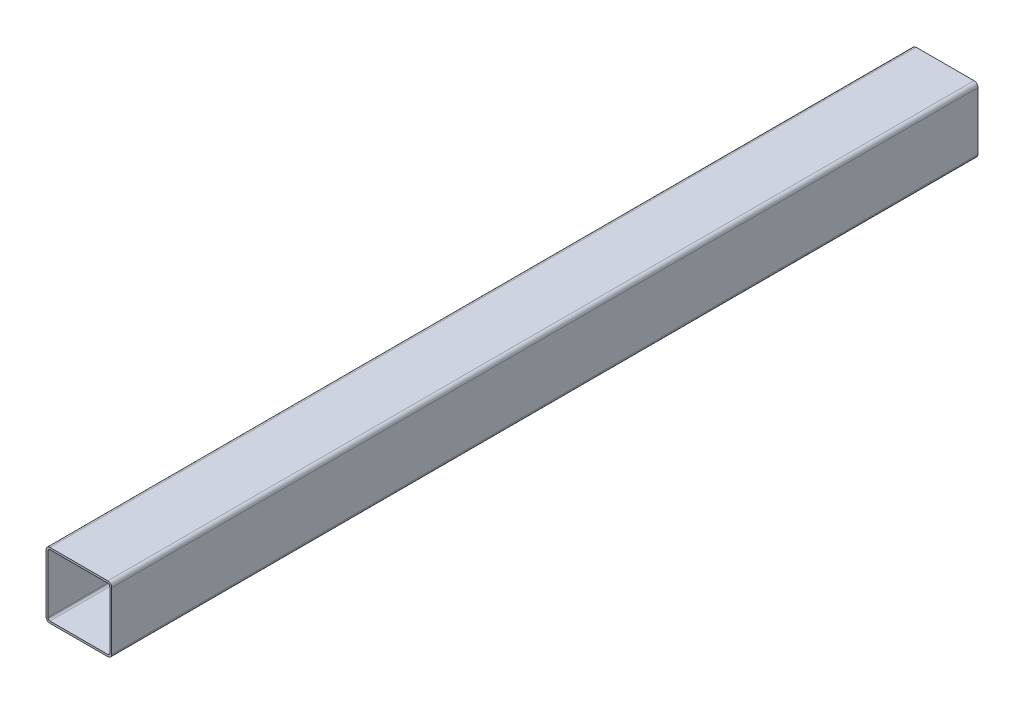
ISO-10303-21;
HEADER;
FILE_DESCRIPTION(('STEP AP214'),'2;1');
FILE_NAME('part.step','',(''),(''),'','','');
FILE_SCHEMA(('AUTOMOTIVE_DESIGN { 1 0 10303 214 1 1 1 1 }'));
ENDSEC;
DATA;
#1=APPLICATION_CONTEXT('core data for automotive mechanical design processes');
#2=APPLICATION_PROTOCOL_DEFINITION('international standard','automotive_design',2000,#1);
#3=PRODUCT_CONTEXT('',#1,'mechanical');
#4=PRODUCT('Part','Part','',(#3));
#5=PRODUCT_RELATED_PRODUCT_CATEGORY('part','',(#4));
#6=PRODUCT_DEFINITION_FORMATION('','',#4);
#7=PRODUCT_DEFINITION_CONTEXT('part definition',#1,'design');
#8=PRODUCT_DEFINITION('design','',#6,#7);
#9=PRODUCT_DEFINITION_SHAPE('','',#8);
#10=(LENGTH_UNIT() NAMED_UNIT(*) SI_UNIT(.MILLI.,.METRE.));
#11=(NAMED_UNIT(*) PLANE_ANGLE_UNIT() SI_UNIT($,.RADIAN.));
#12=(NAMED_UNIT(*) SI_UNIT($,.STERADIAN.) SOLID_ANGLE_UNIT());
#13=UNCERTAINTY_MEASURE_WITH_UNIT(LENGTH_MEASURE(1.E-05),#10,'distance_accuracy_value','');
#14=(GEOMETRIC_REPRESENTATION_CONTEXT(3) GLOBAL_UNCERTAINTY_ASSIGNED_CONTEXT((#13)) GLOBAL_UNIT_ASSIGNED_CONTEXT((#10,
#11,#12)) REPRESENTATION_CONTEXT('',''));
#15=CARTESIAN_POINT('',(0.,0.,0.));
#16=DIRECTION('',(0.,0.,1.));
#17=DIRECTION('',(1.,0.,0.));
#18=AXIS2_PLACEMENT_3D('',#15,#16,#17);
#19=CARTESIAN_POINT('',(94.,6.,1318.));
#20=DIRECTION('',(0.,0.,1.));
#21=DIRECTION('',(1.,0.,0.));
#22=AXIS2_PLACEMENT_3D('',#19,#20,#21);
#23=PLANE('',#22);
#24=CARTESIAN_POINT('',(94.,6.,1318.));
#25=DIRECTION('',(0.,0.,1.));
#26=DIRECTION('',(1.,0.,0.));
#27=AXIS2_PLACEMENT_3D('',#24,#25,#26);
#28=CIRCLE('',#27,6.);
#29=CARTESIAN_POINT('',(94.,0.,1318.));
#30=VERTEX_POINT('',#29);
#31=CARTESIAN_POINT('',(100.,6.00000000000004,1318.));
#32=VERTEX_POINT('',#31);
#33=EDGE_CURVE('E211',#30,#32,#28,.T.);
#34=ORIENTED_EDGE('',*,*,#33,.T.);
#35=DIRECTION('',(0.,1.,0.));
#36=VECTOR('',#35,1.);
#37=CARTESIAN_POINT('',(100.,6.00000000000004,1318.));
#38=LINE('',#37,#36);
#39=CARTESIAN_POINT('',(100.,94.,1318.));
#40=VERTEX_POINT('',#39);
#41=EDGE_CURVE('E214',#32,#40,#38,.T.);
#42=ORIENTED_EDGE('',*,*,#41,.T.);
#43=CARTESIAN_POINT('',(94.,94.,1318.));
#44=DIRECTION('',(0.,0.,1.));
#45=DIRECTION('',(-1.,0.,0.));
#46=AXIS2_PLACEMENT_3D('',#43,#44,#45);
#47=CIRCLE('',#46,6.00000000000001);
#48=CARTESIAN_POINT('',(94.,100.,1318.));
#49=VERTEX_POINT('',#48);
#50=EDGE_CURVE('E217',#40,#49,#47,.T.);
#51=ORIENTED_EDGE('',*,*,#50,.T.);
#52=DIRECTION('',(-1.,0.,0.));
#53=VECTOR('',#52,1.);
#54=CARTESIAN_POINT('',(6.00000000000004,100.,1318.));
#55=LINE('',#54,#53);
#56=CARTESIAN_POINT('',(6.00000000000004,100.,1318.));
#57=VERTEX_POINT('',#56);
#58=EDGE_CURVE('E219',#49,#57,#55,.T.);
#59=ORIENTED_EDGE('',*,*,#58,.T.);
#60=CARTESIAN_POINT('',(6.,94.,1318.));
#61=DIRECTION('',(0.,0.,1.));
#62=DIRECTION('',(-1.,0.,0.));
#63=AXIS2_PLACEMENT_3D('',#60,#61,#62);
#64=CIRCLE('',#63,6.);
#65=CARTESIAN_POINT('',(0.,94.,1318.));
#66=VERTEX_POINT('',#65);
#67=EDGE_CURVE('E221',#57,#66,#64,.T.);
#68=ORIENTED_EDGE('',*,*,#67,.T.);
#69=DIRECTION('',(0.,-1.,0.));
#70=VECTOR('',#69,1.);
#71=CARTESIAN_POINT('',(0.,6.00000000000004,1318.));
#72=LINE('',#71,#70);
#73=CARTESIAN_POINT('',(0.,6.,1318.));
#74=VERTEX_POINT('',#73);
#75=EDGE_CURVE('E223',#66,#74,#72,.T.);
#76=ORIENTED_EDGE('',*,*,#75,.T.);
#77=CARTESIAN_POINT('',(6.,6.,1318.));
#78=DIRECTION('',(0.,0.,1.));
#79=DIRECTION('',(-1.,0.,0.));
#80=AXIS2_PLACEMENT_3D('',#77,#78,#79);
#81=CIRCLE('',#80,6.);
#82=CARTESIAN_POINT('',(6.00000000000004,0.,1318.));
#83=VERTEX_POINT('',#82);
#84=EDGE_CURVE('E225',#74,#83,#81,.T.);
#85=ORIENTED_EDGE('',*,*,#84,.T.);
#86=DIRECTION('',(1.,0.,0.));
#87=VECTOR('',#86,1.);
#88=CARTESIAN_POINT('',(6.00000000000004,0.,1318.));
#89=LINE('',#88,#87);
#90=EDGE_CURVE('E227',#83,#30,#89,.T.);
#91=ORIENTED_EDGE('',*,*,#90,.T.);
#92=EDGE_LOOP('',(#34,#42,#51,#59,#68,#76,#85,#91));
#93=FACE_BOUND('',#92,.T.);
#94=DIRECTION('',(1.,0.,0.));
#95=VECTOR('',#94,1.);
#96=CARTESIAN_POINT('',(6.00000000000004,3.,1318.));
#97=LINE('',#96,#95);
#98=CARTESIAN_POINT('',(6.00000000000004,3.,1318.));
#99=VERTEX_POINT('',#98);
#100=CARTESIAN_POINT('',(94.,3.,1318.));
#101=VERTEX_POINT('',#100);
#102=EDGE_CURVE('E154',#99,#101,#97,.T.);
#103=ORIENTED_EDGE('',*,*,#102,.F.);
#104=CARTESIAN_POINT('',(6.,6.,1318.));
#105=DIRECTION('',(0.,0.,1.));
#106=DIRECTION('',(-1.,0.,0.));
#107=AXIS2_PLACEMENT_3D('',#104,#105,#106);
#108=CIRCLE('',#107,3.);
#109=CARTESIAN_POINT('',(3.,6.00000000000004,1318.));
#110=VERTEX_POINT('',#109);
#111=EDGE_CURVE('E146',#110,#99,#108,.T.);
#112=ORIENTED_EDGE('',*,*,#111,.F.);
#113=DIRECTION('',(0.,-1.,0.));
#114=VECTOR('',#113,1.);
#115=CARTESIAN_POINT('',(3.,6.00000000000004,1318.));
#116=LINE('',#115,#114);
#117=CARTESIAN_POINT('',(3.,94.,1318.));
#118=VERTEX_POINT('',#117);
#119=EDGE_CURVE('E179',#118,#110,#116,.T.);
#120=ORIENTED_EDGE('',*,*,#119,.F.);
#121=CARTESIAN_POINT('',(6.,94.,1318.));
#122=DIRECTION('',(0.,0.,1.));
#123=DIRECTION('',(-1.,0.,0.));
#124=AXIS2_PLACEMENT_3D('',#121,#122,#123);
#125=CIRCLE('',#124,3.);
#126=CARTESIAN_POINT('',(6.00000000000002,97.,1318.));
#127=VERTEX_POINT('',#126);
#128=EDGE_CURVE('E177',#127,#118,#125,.T.);
#129=ORIENTED_EDGE('',*,*,#128,.F.);
#130=DIRECTION('',(-1.,0.,0.));
#131=VECTOR('',#130,1.);
#132=CARTESIAN_POINT('',(6.00000000000002,97.,1318.));
#133=LINE('',#132,#131);
#134=CARTESIAN_POINT('',(94.,97.,1318.));
#135=VERTEX_POINT('',#134);
#136=EDGE_CURVE('E175',#135,#127,#133,.T.);
#137=ORIENTED_EDGE('',*,*,#136,.F.);
#138=CARTESIAN_POINT('',(94.,94.,1318.));
#139=DIRECTION('',(0.,0.,1.));
#140=DIRECTION('',(-1.,0.,0.));
#141=AXIS2_PLACEMENT_3D('',#138,#139,#140);
#142=CIRCLE('',#141,3.);
#143=CARTESIAN_POINT('',(97.,94.,1318.));
#144=VERTEX_POINT('',#143);
#145=EDGE_CURVE('E173',#144,#135,#142,.T.);
#146=ORIENTED_EDGE('',*,*,#145,.F.);
#147=DIRECTION('',(0.,1.,0.));
#148=VECTOR('',#147,1.);
#149=CARTESIAN_POINT('',(97.,6.00000000000004,1318.));
#150=LINE('',#149,#148);
#151=CARTESIAN_POINT('',(97.,6.00000000000004,1318.));
#152=VERTEX_POINT('',#151);
#153=EDGE_CURVE('E169',#152,#144,#150,.T.);
#154=ORIENTED_EDGE('',*,*,#153,.F.);
#155=CARTESIAN_POINT('',(94.,6.,1318.));
#156=DIRECTION('',(0.,0.,1.));
#157=DIRECTION('',(1.,0.,0.));
#158=AXIS2_PLACEMENT_3D('',#155,#156,#157);
#159=CIRCLE('',#158,3.);
#160=EDGE_CURVE('E167',#101,#152,#159,.T.);
#161=ORIENTED_EDGE('',*,*,#160,.F.);
#162=EDGE_LOOP('',(#103,#112,#120,#129,#137,#146,#154,#161));
#163=FACE_BOUND('',#162,.T.);
#164=ADVANCED_FACE('F33',(#93,#163),#23,.T.);
#165=CARTESIAN_POINT('',(94.,6.,0.));
#166=DIRECTION('',(0.,0.,1.));
#167=DIRECTION('',(1.,0.,0.));
#168=AXIS2_PLACEMENT_3D('',#165,#166,#167);
#169=PLANE('',#168);
#170=CARTESIAN_POINT('',(94.,6.,0.));
#171=DIRECTION('',(0.,0.,1.));
#172=DIRECTION('',(1.,0.,0.));
#173=AXIS2_PLACEMENT_3D('',#170,#171,#172);
#174=CIRCLE('',#173,6.);
#175=CARTESIAN_POINT('',(94.,0.,0.));
#176=VERTEX_POINT('',#175);
#177=CARTESIAN_POINT('',(100.,6.00000000000004,0.));
#178=VERTEX_POINT('',#177);
#179=EDGE_CURVE('E162',#176,#178,#174,.T.);
#180=ORIENTED_EDGE('',*,*,#179,.F.);
#181=DIRECTION('',(1.,0.,0.));
#182=VECTOR('',#181,1.);
#183=CARTESIAN_POINT('',(6.00000000000004,0.,0.));
#184=LINE('',#183,#182);
#185=CARTESIAN_POINT('',(6.00000000000004,0.,0.));
#186=VERTEX_POINT('',#185);
#187=EDGE_CURVE('E215',#186,#176,#184,.T.);
#188=ORIENTED_EDGE('',*,*,#187,.F.);
#189=CARTESIAN_POINT('',(6.,6.,0.));
#190=DIRECTION('',(0.,0.,1.));
#191=DIRECTION('',(-1.,0.,0.));
#192=AXIS2_PLACEMENT_3D('',#189,#190,#191);
#193=CIRCLE('',#192,6.);
#194=CARTESIAN_POINT('',(0.,6.,0.));
#195=VERTEX_POINT('',#194);
#196=EDGE_CURVE('E242',#195,#186,#193,.T.);
#197=ORIENTED_EDGE('',*,*,#196,.F.);
#198=DIRECTION('',(0.,-1.,0.));
#199=VECTOR('',#198,1.);
#200=CARTESIAN_POINT('',(0.,6.00000000000004,0.));
#201=LINE('',#200,#199);
#202=CARTESIAN_POINT('',(0.,94.,0.));
#203=VERTEX_POINT('',#202);
#204=EDGE_CURVE('E240',#203,#195,#201,.T.);
#205=ORIENTED_EDGE('',*,*,#204,.F.);
#206=CARTESIAN_POINT('',(6.,94.,0.));
#207=DIRECTION('',(0.,0.,1.));
#208=DIRECTION('',(-1.,0.,0.));
#209=AXIS2_PLACEMENT_3D('',#206,#207,#208);
#210=CIRCLE('',#209,6.);
#211=CARTESIAN_POINT('',(6.00000000000004,100.,0.));
#212=VERTEX_POINT('',#211);
#213=EDGE_CURVE('E238',#212,#203,#210,.T.);
#214=ORIENTED_EDGE('',*,*,#213,.F.);
#215=DIRECTION('',(-1.,0.,0.));
#216=VECTOR('',#215,1.);
#217=CARTESIAN_POINT('',(6.00000000000004,100.,0.));
#218=LINE('',#217,#216);
#219=CARTESIAN_POINT('',(94.,100.,0.));
#220=VERTEX_POINT('',#219);
#221=EDGE_CURVE('E236',#220,#212,#218,.T.);
#222=ORIENTED_EDGE('',*,*,#221,.F.);
#223=CARTESIAN_POINT('',(94.,94.,0.));
#224=DIRECTION('',(0.,0.,1.));
#225=DIRECTION('',(-1.,0.,0.));
#226=AXIS2_PLACEMENT_3D('',#223,#224,#225);
#227=CIRCLE('',#226,6.00000000000001);
#228=CARTESIAN_POINT('',(100.,94.,0.));
#229=VERTEX_POINT('',#228);
#230=EDGE_CURVE('E234',#229,#220,#227,.T.);
#231=ORIENTED_EDGE('',*,*,#230,.F.);
#232=DIRECTION('',(0.,1.,0.));
#233=VECTOR('',#232,1.);
#234=CARTESIAN_POINT('',(100.,6.00000000000004,0.));
#235=LINE('',#234,#233);
#236=EDGE_CURVE('E232',#178,#229,#235,.T.);
#237=ORIENTED_EDGE('',*,*,#236,.F.);
#238=EDGE_LOOP('',(#180,#188,#197,#205,#214,#222,#231,#237));
#239=FACE_BOUND('',#238,.T.);
#240=CARTESIAN_POINT('',(6.,6.,0.));
#241=DIRECTION('',(0.,0.,1.));
#242=DIRECTION('',(-1.,0.,0.));
#243=AXIS2_PLACEMENT_3D('',#240,#241,#242);
#244=CIRCLE('',#243,3.);
#245=CARTESIAN_POINT('',(3.,6.00000000000004,0.));
#246=VERTEX_POINT('',#245);
#247=CARTESIAN_POINT('',(6.00000000000004,3.,0.));
#248=VERTEX_POINT('',#247);
#249=EDGE_CURVE('E56',#246,#248,#244,.T.);
#250=ORIENTED_EDGE('',*,*,#249,.T.);
#251=DIRECTION('',(1.,0.,0.));
#252=VECTOR('',#251,1.);
#253=CARTESIAN_POINT('',(6.00000000000004,3.,0.));
#254=LINE('',#253,#252);
#255=CARTESIAN_POINT('',(94.,3.,0.));
#256=VERTEX_POINT('',#255);
#257=EDGE_CURVE('E161',#248,#256,#254,.T.);
#258=ORIENTED_EDGE('',*,*,#257,.T.);
#259=CARTESIAN_POINT('',(94.,6.,0.));
#260=DIRECTION('',(0.,0.,1.));
#261=DIRECTION('',(1.,0.,0.));
#262=AXIS2_PLACEMENT_3D('',#259,#260,#261);
#263=CIRCLE('',#262,3.);
#264=CARTESIAN_POINT('',(97.,6.00000000000004,0.));
#265=VERTEX_POINT('',#264);
#266=EDGE_CURVE('E183',#256,#265,#263,.T.);
#267=ORIENTED_EDGE('',*,*,#266,.T.);
#268=DIRECTION('',(0.,1.,0.));
#269=VECTOR('',#268,1.);
#270=CARTESIAN_POINT('',(97.,6.00000000000004,0.));
#271=LINE('',#270,#269);
#272=CARTESIAN_POINT('',(97.,94.,0.));
#273=VERTEX_POINT('',#272);
#274=EDGE_CURVE('E186',#265,#273,#271,.T.);
#275=ORIENTED_EDGE('',*,*,#274,.T.);
#276=CARTESIAN_POINT('',(94.,94.,0.));
#277=DIRECTION('',(0.,0.,1.));
#278=DIRECTION('',(-1.,0.,0.));
#279=AXIS2_PLACEMENT_3D('',#276,#277,#278);
#280=CIRCLE('',#279,3.);
#281=CARTESIAN_POINT('',(94.,97.,0.));
#282=VERTEX_POINT('',#281);
#283=EDGE_CURVE('E189',#273,#282,#280,.T.);
#284=ORIENTED_EDGE('',*,*,#283,.T.);
#285=DIRECTION('',(-1.,0.,0.));
#286=VECTOR('',#285,1.);
#287=CARTESIAN_POINT('',(6.00000000000002,97.,0.));
#288=LINE('',#287,#286);
#289=CARTESIAN_POINT('',(6.00000000000002,97.,0.));
#290=VERTEX_POINT('',#289);
#291=EDGE_CURVE('E192',#282,#290,#288,.T.);
#292=ORIENTED_EDGE('',*,*,#291,.T.);
#293=CARTESIAN_POINT('',(6.,94.,0.));
#294=DIRECTION('',(0.,0.,1.));
#295=DIRECTION('',(-1.,0.,0.));
#296=AXIS2_PLACEMENT_3D('',#293,#294,#295);
#297=CIRCLE('',#296,3.);
#298=CARTESIAN_POINT('',(3.,94.,0.));
#299=VERTEX_POINT('',#298);
#300=EDGE_CURVE('E195',#290,#299,#297,.T.);
#301=ORIENTED_EDGE('',*,*,#300,.T.);
#302=DIRECTION('',(0.,-1.,0.));
#303=VECTOR('',#302,1.);
#304=CARTESIAN_POINT('',(3.,6.00000000000004,0.));
#305=LINE('',#304,#303);
#306=EDGE_CURVE('E155',#299,#246,#305,.T.);
#307=ORIENTED_EDGE('',*,*,#306,.T.);
#308=EDGE_LOOP('',(#250,#258,#267,#275,#284,#292,#301,#307));
#309=FACE_BOUND('',#308,.T.);
#310=ADVANCED_FACE('F272',(#239,#309),#169,.F.);
#311=CARTESIAN_POINT('',(94.,6.,1318.));
#312=DIRECTION('',(0.,0.,-1.));
#313=DIRECTION('',(-1.,0.,0.));
#314=AXIS2_PLACEMENT_3D('',#311,#312,#313);
#315=CYLINDRICAL_SURFACE('',#314,6.);
#316=ORIENTED_EDGE('',*,*,#179,.T.);
#317=DIRECTION('',(0.,0.,-1.));
#318=VECTOR('',#317,1.);
#319=CARTESIAN_POINT('',(100.,6.00000000000004,1318.));
#320=LINE('',#319,#318);
#321=EDGE_CURVE('E11',#32,#178,#320,.T.);
#322=ORIENTED_EDGE('',*,*,#321,.F.);
#323=ORIENTED_EDGE('',*,*,#33,.F.);
#324=DIRECTION('',(0.,0.,-1.));
#325=VECTOR('',#324,1.);
#326=CARTESIAN_POINT('',(94.,0.,1318.));
#327=LINE('',#326,#325);
#328=EDGE_CURVE('E229',#30,#176,#327,.T.);
#329=ORIENTED_EDGE('',*,*,#328,.T.);
#330=EDGE_LOOP('',(#316,#322,#323,#329));
#331=FACE_BOUND('',#330,.T.);
#332=ADVANCED_FACE('F35',(#331),#315,.T.);
#333=CARTESIAN_POINT('',(100.,6.00000000000004,1318.));
#334=DIRECTION('',(-1.,0.,0.));
#335=DIRECTION('',(0.,0.,1.));
#336=AXIS2_PLACEMENT_3D('',#333,#334,#335);
#337=PLANE('',#336);
#338=ORIENTED_EDGE('',*,*,#236,.T.);
#339=DIRECTION('',(0.,0.,-1.));
#340=VECTOR('',#339,1.);
#341=CARTESIAN_POINT('',(100.,94.,1318.));
#342=LINE('',#341,#340);
#343=EDGE_CURVE('E41',#40,#229,#342,.T.);
#344=ORIENTED_EDGE('',*,*,#343,.F.);
#345=ORIENTED_EDGE('',*,*,#41,.F.);
#346=ORIENTED_EDGE('',*,*,#321,.T.);
#347=EDGE_LOOP('',(#338,#344,#345,#346));
#348=FACE_BOUND('',#347,.T.);
#349=ADVANCED_FACE('F289',(#348),#337,.F.);
#350=CARTESIAN_POINT('',(94.,94.,1318.));
#351=DIRECTION('',(0.,0.,-1.));
#352=DIRECTION('',(-1.,0.,0.));
#353=AXIS2_PLACEMENT_3D('',#350,#351,#352);
#354=CYLINDRICAL_SURFACE('',#353,6.00000000000001);
#355=ORIENTED_EDGE('',*,*,#230,.T.);
#356=DIRECTION('',(0.,0.,-1.));
#357=VECTOR('',#356,1.);
#358=CARTESIAN_POINT('',(94.,100.,1318.));
#359=LINE('',#358,#357);
#360=EDGE_CURVE('E259',#49,#220,#359,.T.);
#361=ORIENTED_EDGE('',*,*,#360,.F.);
#362=ORIENTED_EDGE('',*,*,#50,.F.);
#363=ORIENTED_EDGE('',*,*,#343,.T.);
#364=EDGE_LOOP('',(#355,#361,#362,#363));
#365=FACE_BOUND('',#364,.T.);
#366=ADVANCED_FACE('F266',(#365),#354,.T.);
#367=CARTESIAN_POINT('',(6.00000000000004,100.,1318.));
#368=DIRECTION('',(0.,-1.,0.));
#369=DIRECTION('',(0.,0.,-1.));
#370=AXIS2_PLACEMENT_3D('',#367,#368,#369);
#371=PLANE('',#370);
#372=ORIENTED_EDGE('',*,*,#221,.T.);
#373=DIRECTION('',(0.,0.,-1.));
#374=VECTOR('',#373,1.);
#375=CARTESIAN_POINT('',(6.00000000000004,100.,1318.));
#376=LINE('',#375,#374);
#377=EDGE_CURVE('E256',#57,#212,#376,.T.);
#378=ORIENTED_EDGE('',*,*,#377,.F.);
#379=ORIENTED_EDGE('',*,*,#58,.F.);
#380=ORIENTED_EDGE('',*,*,#360,.T.);
#381=EDGE_LOOP('',(#372,#378,#379,#380));
#382=FACE_BOUND('',#381,.T.);
#383=ADVANCED_FACE('F278',(#382),#371,.F.);
#384=CARTESIAN_POINT('',(6.,94.,1318.));
#385=DIRECTION('',(0.,0.,-1.));
#386=DIRECTION('',(-1.,0.,0.));
#387=AXIS2_PLACEMENT_3D('',#384,#385,#386);
#388=CYLINDRICAL_SURFACE('',#387,6.);
#389=ORIENTED_EDGE('',*,*,#213,.T.);
#390=DIRECTION('',(0.,0.,-1.));
#391=VECTOR('',#390,1.);
#392=CARTESIAN_POINT('',(0.,94.,1318.));
#393=LINE('',#392,#391);
#394=EDGE_CURVE('E253',#66,#203,#393,.T.);
#395=ORIENTED_EDGE('',*,*,#394,.F.);
#396=ORIENTED_EDGE('',*,*,#67,.F.);
#397=ORIENTED_EDGE('',*,*,#377,.T.);
#398=EDGE_LOOP('',(#389,#395,#396,#397));
#399=FACE_BOUND('',#398,.T.);
#400=ADVANCED_FACE('F282',(#399),#388,.T.);
#401=CARTESIAN_POINT('',(0.,6.00000000000004,1318.));
#402=DIRECTION('',(1.,0.,0.));
#403=DIRECTION('',(0.,0.,-1.));
#404=AXIS2_PLACEMENT_3D('',#401,#402,#403);
#405=PLANE('',#404);
#406=ORIENTED_EDGE('',*,*,#204,.T.);
#407=DIRECTION('',(0.,0.,-1.));
#408=VECTOR('',#407,1.);
#409=CARTESIAN_POINT('',(0.,6.,1318.));
#410=LINE('',#409,#408);
#411=EDGE_CURVE('E250',#74,#195,#410,.T.);
#412=ORIENTED_EDGE('',*,*,#411,.F.);
#413=ORIENTED_EDGE('',*,*,#75,.F.);
#414=ORIENTED_EDGE('',*,*,#394,.T.);
#415=EDGE_LOOP('',(#406,#412,#413,#414));
#416=FACE_BOUND('',#415,.T.);
#417=ADVANCED_FACE('F302',(#416),#405,.F.);
#418=CARTESIAN_POINT('',(6.,6.,1318.));
#419=DIRECTION('',(0.,0.,-1.));
#420=DIRECTION('',(-1.,0.,0.));
#421=AXIS2_PLACEMENT_3D('',#418,#419,#420);
#422=CYLINDRICAL_SURFACE('',#421,6.);
#423=ORIENTED_EDGE('',*,*,#196,.T.);
#424=DIRECTION('',(0.,0.,-1.));
#425=VECTOR('',#424,1.);
#426=CARTESIAN_POINT('',(6.00000000000004,0.,1318.));
#427=LINE('',#426,#425);
#428=EDGE_CURVE('E247',#83,#186,#427,.T.);
#429=ORIENTED_EDGE('',*,*,#428,.F.);
#430=ORIENTED_EDGE('',*,*,#84,.F.);
#431=ORIENTED_EDGE('',*,*,#411,.T.);
#432=EDGE_LOOP('',(#423,#429,#430,#431));
#433=FACE_BOUND('',#432,.T.);
#434=ADVANCED_FACE('F300',(#433),#422,.T.);
#435=CARTESIAN_POINT('',(6.00000000000004,0.,1318.));
#436=DIRECTION('',(0.,1.,0.));
#437=DIRECTION('',(0.,0.,1.));
#438=AXIS2_PLACEMENT_3D('',#435,#436,#437);
#439=PLANE('',#438);
#440=ORIENTED_EDGE('',*,*,#187,.T.);
#441=ORIENTED_EDGE('',*,*,#328,.F.);
#442=ORIENTED_EDGE('',*,*,#90,.F.);
#443=ORIENTED_EDGE('',*,*,#428,.T.);
#444=EDGE_LOOP('',(#440,#441,#442,#443));
#445=FACE_BOUND('',#444,.T.);
#446=ADVANCED_FACE('F295',(#445),#439,.F.);
#447=CARTESIAN_POINT('',(6.,6.,1318.));
#448=DIRECTION('',(0.,0.,-1.));
#449=DIRECTION('',(-1.,0.,0.));
#450=AXIS2_PLACEMENT_3D('',#447,#448,#449);
#451=CYLINDRICAL_SURFACE('',#450,3.);
#452=ORIENTED_EDGE('',*,*,#249,.F.);
#453=DIRECTION('',(0.,0.,-1.));
#454=VECTOR('',#453,1.);
#455=CARTESIAN_POINT('',(3.,6.00000000000004,1318.));
#456=LINE('',#455,#454);
#457=EDGE_CURVE('E150',#110,#246,#456,.T.);
#458=ORIENTED_EDGE('',*,*,#457,.F.);
#459=ORIENTED_EDGE('',*,*,#111,.T.);
#460=DIRECTION('',(0.,0.,-1.));
#461=VECTOR('',#460,1.);
#462=CARTESIAN_POINT('',(6.00000000000004,3.,1318.));
#463=LINE('',#462,#461);
#464=EDGE_CURVE('E149',#99,#248,#463,.T.);
#465=ORIENTED_EDGE('',*,*,#464,.T.);
#466=EDGE_LOOP('',(#452,#458,#459,#465));
#467=FACE_BOUND('',#466,.T.);
#468=ADVANCED_FACE('F148',(#467),#451,.F.);
#469=CARTESIAN_POINT('',(6.00000000000004,3.,1318.));
#470=DIRECTION('',(0.,1.,0.));
#471=DIRECTION('',(-1.,0.,0.));
#472=AXIS2_PLACEMENT_3D('',#469,#470,#471);
#473=PLANE('',#472);
#474=ORIENTED_EDGE('',*,*,#257,.F.);
#475=ORIENTED_EDGE('',*,*,#464,.F.);
#476=ORIENTED_EDGE('',*,*,#102,.T.);
#477=DIRECTION('',(0.,0.,-1.));
#478=VECTOR('',#477,1.);
#479=CARTESIAN_POINT('',(94.,3.,1318.));
#480=LINE('',#479,#478);
#481=EDGE_CURVE('E163',#101,#256,#480,.T.);
#482=ORIENTED_EDGE('',*,*,#481,.T.);
#483=EDGE_LOOP('',(#474,#475,#476,#482));
#484=FACE_BOUND('',#483,.T.);
#485=ADVANCED_FACE('F158',(#484),#473,.T.);
#486=CARTESIAN_POINT('',(94.,6.,1318.));
#487=DIRECTION('',(0.,0.,-1.));
#488=DIRECTION('',(-1.,0.,0.));
#489=AXIS2_PLACEMENT_3D('',#486,#487,#488);
#490=CYLINDRICAL_SURFACE('',#489,3.);
#491=ORIENTED_EDGE('',*,*,#266,.F.);
#492=ORIENTED_EDGE('',*,*,#481,.F.);
#493=ORIENTED_EDGE('',*,*,#160,.T.);
#494=DIRECTION('',(0.,0.,-1.));
#495=VECTOR('',#494,1.);
#496=CARTESIAN_POINT('',(97.,6.00000000000004,1318.));
#497=LINE('',#496,#495);
#498=EDGE_CURVE('E208',#152,#265,#497,.T.);
#499=ORIENTED_EDGE('',*,*,#498,.T.);
#500=EDGE_LOOP('',(#491,#492,#493,#499));
#501=FACE_BOUND('',#500,.T.);
#502=ADVANCED_FACE('F327',(#501),#490,.F.);
#503=CARTESIAN_POINT('',(97.,6.00000000000004,1318.));
#504=DIRECTION('',(-1.,0.,0.));
#505=DIRECTION('',(0.,0.,1.));
#506=AXIS2_PLACEMENT_3D('',#503,#504,#505);
#507=PLANE('',#506);
#508=ORIENTED_EDGE('',*,*,#274,.F.);
#509=ORIENTED_EDGE('',*,*,#498,.F.);
#510=ORIENTED_EDGE('',*,*,#153,.T.);
#511=DIRECTION('',(0.,0.,-1.));
#512=VECTOR('',#511,1.);
#513=CARTESIAN_POINT('',(97.,94.,1318.));
#514=LINE('',#513,#512);
#515=EDGE_CURVE('E206',#144,#273,#514,.T.);
#516=ORIENTED_EDGE('',*,*,#515,.T.);
#517=EDGE_LOOP('',(#508,#509,#510,#516));
#518=FACE_BOUND('',#517,.T.);
#519=ADVANCED_FACE('F331',(#518),#507,.T.);
#520=CARTESIAN_POINT('',(94.,94.,1318.));
#521=DIRECTION('',(0.,0.,-1.));
#522=DIRECTION('',(-1.,0.,0.));
#523=AXIS2_PLACEMENT_3D('',#520,#521,#522);
#524=CYLINDRICAL_SURFACE('',#523,3.);
#525=ORIENTED_EDGE('',*,*,#283,.F.);
#526=ORIENTED_EDGE('',*,*,#515,.F.);
#527=ORIENTED_EDGE('',*,*,#145,.T.);
#528=DIRECTION('',(0.,0.,-1.));
#529=VECTOR('',#528,1.);
#530=CARTESIAN_POINT('',(94.,97.,1318.));
#531=LINE('',#530,#529);
#532=EDGE_CURVE('E204',#135,#282,#531,.T.);
#533=ORIENTED_EDGE('',*,*,#532,.T.);
#534=EDGE_LOOP('',(#525,#526,#527,#533));
#535=FACE_BOUND('',#534,.T.);
#536=ADVANCED_FACE('F337',(#535),#524,.F.);
#537=CARTESIAN_POINT('',(6.00000000000002,97.,1318.));
#538=DIRECTION('',(0.,-1.,0.));
#539=DIRECTION('',(0.,0.,-1.));
#540=AXIS2_PLACEMENT_3D('',#537,#538,#539);
#541=PLANE('',#540);
#542=ORIENTED_EDGE('',*,*,#291,.F.);
#543=ORIENTED_EDGE('',*,*,#532,.F.);
#544=ORIENTED_EDGE('',*,*,#136,.T.);
#545=DIRECTION('',(0.,0.,-1.));
#546=VECTOR('',#545,1.);
#547=CARTESIAN_POINT('',(6.00000000000002,97.,1318.));
#548=LINE('',#547,#546);
#549=EDGE_CURVE('E202',#127,#290,#548,.T.);
#550=ORIENTED_EDGE('',*,*,#549,.T.);
#551=EDGE_LOOP('',(#542,#543,#544,#550));
#552=FACE_BOUND('',#551,.T.);
#553=ADVANCED_FACE('F341',(#552),#541,.T.);
#554=CARTESIAN_POINT('',(6.,94.,1318.));
#555=DIRECTION('',(0.,0.,-1.));
#556=DIRECTION('',(-1.,0.,0.));
#557=AXIS2_PLACEMENT_3D('',#554,#555,#556);
#558=CYLINDRICAL_SURFACE('',#557,3.);
#559=ORIENTED_EDGE('',*,*,#300,.F.);
#560=ORIENTED_EDGE('',*,*,#549,.F.);
#561=ORIENTED_EDGE('',*,*,#128,.T.);
#562=DIRECTION('',(0.,0.,-1.));
#563=VECTOR('',#562,1.);
#564=CARTESIAN_POINT('',(3.,94.,1318.));
#565=LINE('',#564,#563);
#566=EDGE_CURVE('E48',#118,#299,#565,.T.);
#567=ORIENTED_EDGE('',*,*,#566,.T.);
#568=EDGE_LOOP('',(#559,#560,#561,#567));
#569=FACE_BOUND('',#568,.T.);
#570=ADVANCED_FACE('F345',(#569),#558,.F.);
#571=CARTESIAN_POINT('',(3.,6.00000000000004,1318.));
#572=DIRECTION('',(1.,0.,0.));
#573=DIRECTION('',(0.,0.,-1.));
#574=AXIS2_PLACEMENT_3D('',#571,#572,#573);
#575=PLANE('',#574);
#576=ORIENTED_EDGE('',*,*,#306,.F.);
#577=ORIENTED_EDGE('',*,*,#566,.F.);
#578=ORIENTED_EDGE('',*,*,#119,.T.);
#579=ORIENTED_EDGE('',*,*,#457,.T.);
#580=EDGE_LOOP('',(#576,#577,#578,#579));
#581=FACE_BOUND('',#580,.T.);
#582=ADVANCED_FACE('F349',(#581),#575,.T.);
#583=CLOSED_SHELL('',(#164,#310,#332,#349,#366,#383,#400,#417,#434,#446,#468,#485,#502,#519,
#536,#553,#570,#582));
#584=MANIFOLD_SOLID_BREP('B2',#583);
#585=ADVANCED_BREP_SHAPE_REPRESENTATION('',(#18,#584),#14);
#586=SHAPE_DEFINITION_REPRESENTATION(#9,#585);
ENDSEC;
END-ISO-10303-21;
